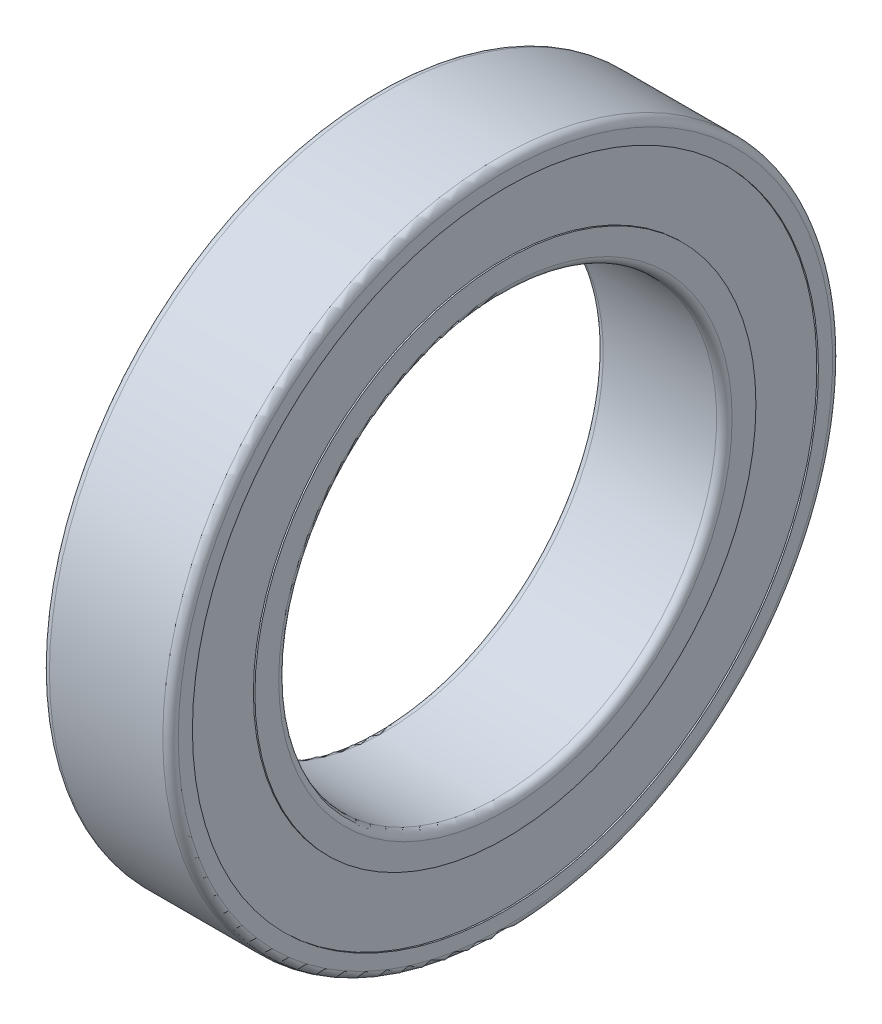
ISO-10303-21;
HEADER;
FILE_DESCRIPTION(('STEP AP214'),'2;1');
FILE_NAME('part.step','',(''),(''),'','','');
FILE_SCHEMA(('AUTOMOTIVE_DESIGN { 1 0 10303 214 1 1 1 1 }'));
ENDSEC;
DATA;
#1=APPLICATION_CONTEXT('core data for automotive mechanical design processes');
#2=APPLICATION_PROTOCOL_DEFINITION('international standard','automotive_design',2000,#1);
#3=PRODUCT_CONTEXT('',#1,'mechanical');
#4=PRODUCT('Part','Part','',(#3));
#5=PRODUCT_RELATED_PRODUCT_CATEGORY('part','',(#4));
#6=PRODUCT_DEFINITION_FORMATION('','',#4);
#7=PRODUCT_DEFINITION_CONTEXT('part definition',#1,'design');
#8=PRODUCT_DEFINITION('design','',#6,#7);
#9=PRODUCT_DEFINITION_SHAPE('','',#8);
#10=(LENGTH_UNIT() NAMED_UNIT(*) SI_UNIT(.MILLI.,.METRE.));
#11=(NAMED_UNIT(*) PLANE_ANGLE_UNIT() SI_UNIT($,.RADIAN.));
#12=(NAMED_UNIT(*) SI_UNIT($,.STERADIAN.) SOLID_ANGLE_UNIT());
#13=UNCERTAINTY_MEASURE_WITH_UNIT(LENGTH_MEASURE(1.E-05),#10,'distance_accuracy_value','');
#14=(GEOMETRIC_REPRESENTATION_CONTEXT(3) GLOBAL_UNCERTAINTY_ASSIGNED_CONTEXT((#13)) GLOBAL_UNIT_ASSIGNED_CONTEXT((#10,
#11,#12)) REPRESENTATION_CONTEXT('',''));
#15=CARTESIAN_POINT('',(0.,0.,0.));
#16=DIRECTION('',(0.,0.,1.));
#17=DIRECTION('',(1.,0.,0.));
#18=AXIS2_PLACEMENT_3D('',#15,#16,#17);
#19=CARTESIAN_POINT('',(0.,-9.99072548823191,-9.725));
#20=DIRECTION('',(-1.,0.,0.));
#21=DIRECTION('',(0.,0.,1.));
#22=AXIS2_PLACEMENT_3D('',#19,#20,#21);
#23=PLANE('',#22);
#24=CARTESIAN_POINT('',(0.,0.,0.));
#25=DIRECTION('',(-1.,0.,0.));
#26=DIRECTION('',(0.,0.,-1.));
#27=AXIS2_PLACEMENT_3D('',#24,#25,#26);
#28=CIRCLE('',#27,9.725);
#29=CARTESIAN_POINT('',(0.,0.,-9.725));
#30=VERTEX_POINT('',#29);
#31=EDGE_CURVE('E68',#30,#30,#28,.F.);
#32=ORIENTED_EDGE('',*,*,#31,.F.);
#33=EDGE_LOOP('',(#32));
#34=FACE_BOUND('',#33,.T.);
#35=CARTESIAN_POINT('',(0.,0.,0.));
#36=DIRECTION('',(1.,0.,0.));
#37=DIRECTION('',(0.,0.,1.));
#38=AXIS2_PLACEMENT_3D('',#35,#36,#37);
#39=CIRCLE('',#38,8.8);
#40=CARTESIAN_POINT('',(0.,0.,8.8));
#41=VERTEX_POINT('',#40);
#42=EDGE_CURVE('E65',#41,#41,#39,.T.);
#43=ORIENTED_EDGE('',*,*,#42,.T.);
#44=EDGE_LOOP('',(#43));
#45=FACE_BOUND('',#44,.T.);
#46=ADVANCED_FACE('F15',(#34,#45),#23,.T.);
#47=CARTESIAN_POINT('',(5.,-9.99072548823191,9.725));
#48=DIRECTION('',(1.,0.,0.));
#49=DIRECTION('',(0.,0.,-1.));
#50=AXIS2_PLACEMENT_3D('',#47,#48,#49);
#51=PLANE('',#50);
#52=CARTESIAN_POINT('',(5.,0.,0.));
#53=DIRECTION('',(1.,0.,0.));
#54=DIRECTION('',(0.,0.,1.));
#55=AXIS2_PLACEMENT_3D('',#52,#53,#54);
#56=CIRCLE('',#55,9.725);
#57=CARTESIAN_POINT('',(5.,0.,9.725));
#58=VERTEX_POINT('',#57);
#59=EDGE_CURVE('E62',#58,#58,#56,.T.);
#60=ORIENTED_EDGE('',*,*,#59,.T.);
#61=EDGE_LOOP('',(#60));
#62=FACE_BOUND('',#61,.T.);
#63=CARTESIAN_POINT('',(5.,0.,0.));
#64=DIRECTION('',(-1.,0.,0.));
#65=DIRECTION('',(0.,0.,-1.));
#66=AXIS2_PLACEMENT_3D('',#63,#64,#65);
#67=CIRCLE('',#66,8.80000005419997);
#68=CARTESIAN_POINT('',(5.,0.,-8.80000005419997));
#69=VERTEX_POINT('',#68);
#70=EDGE_CURVE('E59',#69,#69,#67,.F.);
#71=ORIENTED_EDGE('',*,*,#70,.F.);
#72=EDGE_LOOP('',(#71));
#73=FACE_BOUND('',#72,.T.);
#74=ADVANCED_FACE('F76',(#62,#73),#51,.T.);
#75=CARTESIAN_POINT('',(4.9425,-12.4819860855545,12.15));
#76=DIRECTION('',(1.,0.,0.));
#77=DIRECTION('',(0.,0.,-1.));
#78=AXIS2_PLACEMENT_3D('',#75,#76,#77);
#79=PLANE('',#78);
#80=CARTESIAN_POINT('',(4.9425,0.,0.));
#81=DIRECTION('',(1.,0.,0.));
#82=DIRECTION('',(0.,0.,1.));
#83=AXIS2_PLACEMENT_3D('',#80,#81,#82);
#84=CIRCLE('',#83,12.15);
#85=CARTESIAN_POINT('',(4.9425,0.,12.15));
#86=VERTEX_POINT('',#85);
#87=EDGE_CURVE('E56',#86,#86,#84,.T.);
#88=ORIENTED_EDGE('',*,*,#87,.T.);
#89=EDGE_LOOP('',(#88));
#90=FACE_BOUND('',#89,.T.);
#91=CARTESIAN_POINT('',(4.9425,0.,0.));
#92=DIRECTION('',(-1.,0.,0.));
#93=DIRECTION('',(0.,0.,-1.));
#94=AXIS2_PLACEMENT_3D('',#91,#92,#93);
#95=CIRCLE('',#94,9.725);
#96=CARTESIAN_POINT('',(4.9425,0.,-9.725));
#97=VERTEX_POINT('',#96);
#98=EDGE_CURVE('E53',#97,#97,#95,.F.);
#99=ORIENTED_EDGE('',*,*,#98,.F.);
#100=EDGE_LOOP('',(#99));
#101=FACE_BOUND('',#100,.T.);
#102=ADVANCED_FACE('F135',(#90,#101),#79,.T.);
#103=CARTESIAN_POINT('',(5.,-12.9359195434397,12.7));
#104=DIRECTION('',(1.,0.,0.));
#105=DIRECTION('',(0.,0.,-1.));
#106=AXIS2_PLACEMENT_3D('',#103,#104,#105);
#107=PLANE('',#106);
#108=CARTESIAN_POINT('',(5.,0.,0.));
#109=DIRECTION('',(1.,0.,0.));
#110=DIRECTION('',(0.,-1.16841773351946E-09,1.));
#111=AXIS2_PLACEMENT_3D('',#108,#109,#110);
#112=CIRCLE('',#111,12.7);
#113=CARTESIAN_POINT('',(5.,-1.48389052156972E-08,12.7));
#114=VERTEX_POINT('',#113);
#115=EDGE_CURVE('E50',#114,#114,#112,.T.);
#116=ORIENTED_EDGE('',*,*,#115,.T.);
#117=EDGE_LOOP('',(#116));
#118=FACE_BOUND('',#117,.T.);
#119=CARTESIAN_POINT('',(5.,0.,0.));
#120=DIRECTION('',(-1.,0.,0.));
#121=DIRECTION('',(0.,0.,-1.));
#122=AXIS2_PLACEMENT_3D('',#119,#120,#121);
#123=CIRCLE('',#122,12.15);
#124=CARTESIAN_POINT('',(5.,0.,-12.15));
#125=VERTEX_POINT('',#124);
#126=EDGE_CURVE('E47',#125,#125,#123,.F.);
#127=ORIENTED_EDGE('',*,*,#126,.F.);
#128=EDGE_LOOP('',(#127));
#129=FACE_BOUND('',#128,.T.);
#130=ADVANCED_FACE('F130',(#118,#129),#107,.T.);
#131=CARTESIAN_POINT('',(0.,-12.9359195655334,-12.7));
#132=DIRECTION('',(-1.,0.,0.));
#133=DIRECTION('',(0.,0.,1.));
#134=AXIS2_PLACEMENT_3D('',#131,#132,#133);
#135=PLANE('',#134);
#136=CARTESIAN_POINT('',(0.,0.,0.));
#137=DIRECTION('',(-1.,0.,0.));
#138=DIRECTION('',(0.,0.,-1.));
#139=AXIS2_PLACEMENT_3D('',#136,#137,#138);
#140=CIRCLE('',#139,12.7);
#141=CARTESIAN_POINT('',(0.,0.,-12.7));
#142=VERTEX_POINT('',#141);
#143=EDGE_CURVE('E44',#142,#142,#140,.F.);
#144=ORIENTED_EDGE('',*,*,#143,.F.);
#145=EDGE_LOOP('',(#144));
#146=FACE_BOUND('',#145,.T.);
#147=CARTESIAN_POINT('',(0.,0.,0.));
#148=DIRECTION('',(1.,0.,0.));
#149=DIRECTION('',(0.,0.,1.));
#150=AXIS2_PLACEMENT_3D('',#147,#148,#149);
#151=CIRCLE('',#150,12.15);
#152=CARTESIAN_POINT('',(0.,0.,12.15));
#153=VERTEX_POINT('',#152);
#154=EDGE_CURVE('E41',#153,#153,#151,.T.);
#155=ORIENTED_EDGE('',*,*,#154,.T.);
#156=EDGE_LOOP('',(#155));
#157=FACE_BOUND('',#156,.T.);
#158=ADVANCED_FACE('F94',(#146,#157),#135,.T.);
#159=CARTESIAN_POINT('',(0.0575,-12.481986078265,-12.15));
#160=DIRECTION('',(-1.,0.,0.));
#161=DIRECTION('',(0.,0.,1.));
#162=AXIS2_PLACEMENT_3D('',#159,#160,#161);
#163=PLANE('',#162);
#164=CARTESIAN_POINT('',(0.0575,0.,0.));
#165=DIRECTION('',(-1.,0.,0.));
#166=DIRECTION('',(0.,0.,-1.));
#167=AXIS2_PLACEMENT_3D('',#164,#165,#166);
#168=CIRCLE('',#167,12.15);
#169=CARTESIAN_POINT('',(0.0575,0.,-12.15));
#170=VERTEX_POINT('',#169);
#171=EDGE_CURVE('E38',#170,#170,#168,.F.);
#172=ORIENTED_EDGE('',*,*,#171,.F.);
#173=EDGE_LOOP('',(#172));
#174=FACE_BOUND('',#173,.T.);
#175=CARTESIAN_POINT('',(0.0575,0.,0.));
#176=DIRECTION('',(1.,0.,0.));
#177=DIRECTION('',(0.,0.,1.));
#178=AXIS2_PLACEMENT_3D('',#175,#176,#177);
#179=CIRCLE('',#178,9.725);
#180=CARTESIAN_POINT('',(0.0575,0.,9.725));
#181=VERTEX_POINT('',#180);
#182=EDGE_CURVE('E35',#181,#181,#179,.T.);
#183=ORIENTED_EDGE('',*,*,#182,.T.);
#184=EDGE_LOOP('',(#183));
#185=FACE_BOUND('',#184,.T.);
#186=ADVANCED_FACE('F83',(#174,#185),#163,.T.);
#187=CARTESIAN_POINT('',(0.299999999999936,0.,0.));
#188=DIRECTION('',(1.,0.,0.));
#189=DIRECTION('',(0.,0.,1.));
#190=AXIS2_PLACEMENT_3D('',#187,#188,#189);
#191=TOROIDAL_SURFACE('',#190,8.8,0.299999999999936);
#192=CARTESIAN_POINT('',(0.3,0.,0.));
#193=DIRECTION('',(1.,0.,0.));
#194=DIRECTION('',(0.,0.,1.));
#195=AXIS2_PLACEMENT_3D('',#192,#193,#194);
#196=CIRCLE('',#195,8.50000000000006);
#197=CARTESIAN_POINT('',(0.3,0.,8.50000000000006));
#198=VERTEX_POINT('',#197);
#199=EDGE_CURVE('E30',#198,#198,#196,.T.);
#200=ORIENTED_EDGE('',*,*,#199,.T.);
#201=EDGE_LOOP('',(#200));
#202=FACE_BOUND('',#201,.T.);
#203=ORIENTED_EDGE('',*,*,#42,.F.);
#204=EDGE_LOOP('',(#203));
#205=FACE_BOUND('',#204,.T.);
#206=ADVANCED_FACE('F80',(#202,#205),#191,.T.);
#207=CARTESIAN_POINT('',(5.,0.,0.));
#208=DIRECTION('',(1.,0.,0.));
#209=DIRECTION('',(0.,0.,1.));
#210=AXIS2_PLACEMENT_3D('',#207,#208,#209);
#211=CYLINDRICAL_SURFACE('',#210,8.5);
#212=CARTESIAN_POINT('',(4.7,0.,0.));
#213=DIRECTION('',(1.,0.,0.));
#214=DIRECTION('',(0.,0.,1.));
#215=AXIS2_PLACEMENT_3D('',#212,#213,#214);
#216=CIRCLE('',#215,8.5);
#217=CARTESIAN_POINT('',(4.7,0.,8.5));
#218=VERTEX_POINT('',#217);
#219=EDGE_CURVE('E26',#218,#218,#216,.T.);
#220=ORIENTED_EDGE('',*,*,#219,.T.);
#221=EDGE_LOOP('',(#220));
#222=FACE_BOUND('',#221,.T.);
#223=ORIENTED_EDGE('',*,*,#199,.F.);
#224=EDGE_LOOP('',(#223));
#225=FACE_BOUND('',#224,.T.);
#226=ADVANCED_FACE('F82',(#222,#225),#211,.F.);
#227=CARTESIAN_POINT('',(4.70000000000013,0.,0.));
#228=DIRECTION('',(1.,0.,0.));
#229=DIRECTION('',(0.,0.,1.));
#230=AXIS2_PLACEMENT_3D('',#227,#228,#229);
#231=TOROIDAL_SURFACE('',#230,8.79999999999988,0.299999999999875);
#232=ORIENTED_EDGE('',*,*,#70,.T.);
#233=EDGE_LOOP('',(#232));
#234=FACE_BOUND('',#233,.T.);
#235=ORIENTED_EDGE('',*,*,#219,.F.);
#236=EDGE_LOOP('',(#235));
#237=FACE_BOUND('',#236,.T.);
#238=ADVANCED_FACE('F91',(#234,#237),#231,.T.);
#239=CARTESIAN_POINT('',(5.,0.,0.));
#240=DIRECTION('',(1.,0.,0.));
#241=DIRECTION('',(0.,0.,1.));
#242=AXIS2_PLACEMENT_3D('',#239,#240,#241);
#243=CYLINDRICAL_SURFACE('',#242,9.725);
#244=ORIENTED_EDGE('',*,*,#98,.T.);
#245=EDGE_LOOP('',(#244));
#246=FACE_BOUND('',#245,.T.);
#247=ORIENTED_EDGE('',*,*,#59,.F.);
#248=EDGE_LOOP('',(#247));
#249=FACE_BOUND('',#248,.T.);
#250=ADVANCED_FACE('F101',(#246,#249),#243,.T.);
#251=CARTESIAN_POINT('',(5.,0.,0.));
#252=DIRECTION('',(1.,0.,0.));
#253=DIRECTION('',(0.,1.16843036391409E-09,1.));
#254=AXIS2_PLACEMENT_3D('',#251,#252,#253);
#255=CYLINDRICAL_SURFACE('',#254,12.15);
#256=ORIENTED_EDGE('',*,*,#126,.T.);
#257=EDGE_LOOP('',(#256));
#258=FACE_BOUND('',#257,.T.);
#259=ORIENTED_EDGE('',*,*,#87,.F.);
#260=EDGE_LOOP('',(#259));
#261=FACE_BOUND('',#260,.T.);
#262=ADVANCED_FACE('F105',(#258,#261),#255,.F.);
#263=CARTESIAN_POINT('',(4.70000000000012,0.,0.));
#264=DIRECTION('',(1.,0.,0.));
#265=DIRECTION('',(0.,0.,1.));
#266=AXIS2_PLACEMENT_3D('',#263,#264,#265);
#267=TOROIDAL_SURFACE('',#266,12.7000000000001,0.29999999999988);
#268=CARTESIAN_POINT('',(4.70000000000012,0.,0.));
#269=DIRECTION('',(1.,0.,0.));
#270=DIRECTION('',(0.,0.,1.));
#271=AXIS2_PLACEMENT_3D('',#268,#269,#270);
#272=CIRCLE('',#271,13.);
#273=CARTESIAN_POINT('',(4.70000000000012,0.,13.));
#274=VERTEX_POINT('',#273);
#275=EDGE_CURVE('E22',#274,#274,#272,.T.);
#276=ORIENTED_EDGE('',*,*,#275,.T.);
#277=EDGE_LOOP('',(#276));
#278=FACE_BOUND('',#277,.T.);
#279=ORIENTED_EDGE('',*,*,#115,.F.);
#280=EDGE_LOOP('',(#279));
#281=FACE_BOUND('',#280,.T.);
#282=ADVANCED_FACE('F109',(#278,#281),#267,.T.);
#283=CARTESIAN_POINT('',(5.,0.,0.));
#284=DIRECTION('',(1.,0.,0.));
#285=DIRECTION('',(0.,0.,1.));
#286=AXIS2_PLACEMENT_3D('',#283,#284,#285);
#287=CYLINDRICAL_SURFACE('',#286,13.);
#288=CARTESIAN_POINT('',(0.29999999999997,0.,0.));
#289=DIRECTION('',(1.,0.,0.));
#290=DIRECTION('',(0.,0.,1.));
#291=AXIS2_PLACEMENT_3D('',#288,#289,#290);
#292=CIRCLE('',#291,13.);
#293=CARTESIAN_POINT('',(0.29999999999997,0.,13.));
#294=VERTEX_POINT('',#293);
#295=EDGE_CURVE('E10',#294,#294,#292,.T.);
#296=ORIENTED_EDGE('',*,*,#295,.T.);
#297=EDGE_LOOP('',(#296));
#298=FACE_BOUND('',#297,.T.);
#299=ORIENTED_EDGE('',*,*,#275,.F.);
#300=EDGE_LOOP('',(#299));
#301=FACE_BOUND('',#300,.T.);
#302=ADVANCED_FACE('F113',(#298,#301),#287,.T.);
#303=CARTESIAN_POINT('',(0.29999999999994,0.,0.));
#304=DIRECTION('',(1.,0.,0.));
#305=DIRECTION('',(0.,0.,1.));
#306=AXIS2_PLACEMENT_3D('',#303,#304,#305);
#307=TOROIDAL_SURFACE('',#306,12.7,0.299999999999939);
#308=ORIENTED_EDGE('',*,*,#143,.T.);
#309=EDGE_LOOP('',(#308));
#310=FACE_BOUND('',#309,.T.);
#311=ORIENTED_EDGE('',*,*,#295,.F.);
#312=EDGE_LOOP('',(#311));
#313=FACE_BOUND('',#312,.T.);
#314=ADVANCED_FACE('F116',(#310,#313),#307,.T.);
#315=CARTESIAN_POINT('',(5.,0.,0.));
#316=DIRECTION('',(1.,0.,0.));
#317=DIRECTION('',(0.,1.16843036391409E-09,1.));
#318=AXIS2_PLACEMENT_3D('',#315,#316,#317);
#319=CYLINDRICAL_SURFACE('',#318,12.15);
#320=ORIENTED_EDGE('',*,*,#171,.T.);
#321=EDGE_LOOP('',(#320));
#322=FACE_BOUND('',#321,.T.);
#323=ORIENTED_EDGE('',*,*,#154,.F.);
#324=EDGE_LOOP('',(#323));
#325=FACE_BOUND('',#324,.T.);
#326=ADVANCED_FACE('F118',(#322,#325),#319,.F.);
#327=CARTESIAN_POINT('',(5.,0.,0.));
#328=DIRECTION('',(1.,0.,0.));
#329=DIRECTION('',(0.,0.,1.));
#330=AXIS2_PLACEMENT_3D('',#327,#328,#329);
#331=CYLINDRICAL_SURFACE('',#330,9.725);
#332=ORIENTED_EDGE('',*,*,#31,.T.);
#333=EDGE_LOOP('',(#332));
#334=FACE_BOUND('',#333,.T.);
#335=ORIENTED_EDGE('',*,*,#182,.F.);
#336=EDGE_LOOP('',(#335));
#337=FACE_BOUND('',#336,.T.);
#338=ADVANCED_FACE('F17',(#334,#337),#331,.T.);
#339=CLOSED_SHELL('',(#46,#74,#102,#130,#158,#186,#206,#226,#238,#250,#262,#282,#302,#314,#326,#338));
#340=MANIFOLD_SOLID_BREP('B1',#339);
#341=ADVANCED_BREP_SHAPE_REPRESENTATION('',(#18,#340),#14);
#342=SHAPE_DEFINITION_REPRESENTATION(#9,#341);
ENDSEC;
END-ISO-10303-21;
